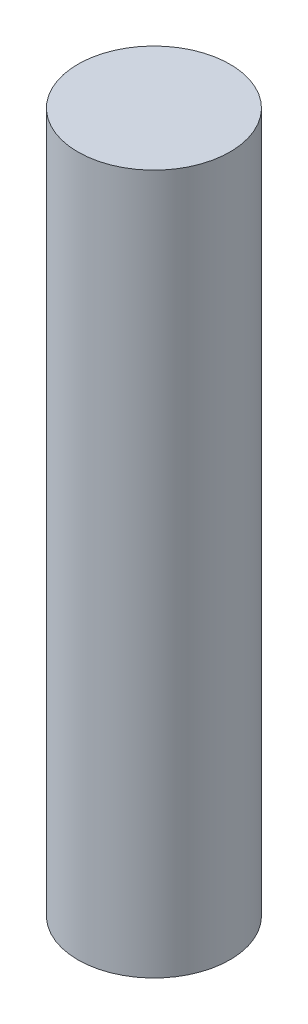
ISO-10303-21;
HEADER;
FILE_DESCRIPTION(('STEP AP214'),'2;1');
FILE_NAME('part.step','',(''),(''),'','','');
FILE_SCHEMA(('AUTOMOTIVE_DESIGN { 1 0 10303 214 1 1 1 1 }'));
ENDSEC;
DATA;
#1=APPLICATION_CONTEXT('core data for automotive mechanical design processes');
#2=APPLICATION_PROTOCOL_DEFINITION('international standard','automotive_design',2000,#1);
#3=PRODUCT_CONTEXT('',#1,'mechanical');
#4=PRODUCT('Part','Part','',(#3));
#5=PRODUCT_RELATED_PRODUCT_CATEGORY('part','',(#4));
#6=PRODUCT_DEFINITION_FORMATION('','',#4);
#7=PRODUCT_DEFINITION_CONTEXT('part definition',#1,'design');
#8=PRODUCT_DEFINITION('design','',#6,#7);
#9=PRODUCT_DEFINITION_SHAPE('','',#8);
#10=(LENGTH_UNIT() NAMED_UNIT(*) SI_UNIT(.MILLI.,.METRE.));
#11=(NAMED_UNIT(*) PLANE_ANGLE_UNIT() SI_UNIT($,.RADIAN.));
#12=(NAMED_UNIT(*) SI_UNIT($,.STERADIAN.) SOLID_ANGLE_UNIT());
#13=UNCERTAINTY_MEASURE_WITH_UNIT(LENGTH_MEASURE(1.E-05),#10,'distance_accuracy_value','');
#14=(GEOMETRIC_REPRESENTATION_CONTEXT(3) GLOBAL_UNCERTAINTY_ASSIGNED_CONTEXT((#13)) GLOBAL_UNIT_ASSIGNED_CONTEXT((#10,
#11,#12)) REPRESENTATION_CONTEXT('',''));
#15=CARTESIAN_POINT('',(0.,0.,0.));
#16=DIRECTION('',(0.,0.,1.));
#17=DIRECTION('',(1.,0.,0.));
#18=AXIS2_PLACEMENT_3D('',#15,#16,#17);
#19=CARTESIAN_POINT('',(0.,46.,0.));
#20=DIRECTION('',(0.,-1.,0.));
#21=DIRECTION('',(0.,0.,-1.));
#22=AXIS2_PLACEMENT_3D('',#19,#20,#21);
#23=CYLINDRICAL_SURFACE('',#22,5.);
#24=CARTESIAN_POINT('',(0.,46.,0.));
#25=DIRECTION('',(0.,1.,0.));
#26=DIRECTION('',(0.,0.,1.));
#27=AXIS2_PLACEMENT_3D('',#24,#25,#26);
#28=CIRCLE('',#27,5.);
#29=CARTESIAN_POINT('',(0.,46.,5.));
#30=VERTEX_POINT('',#29);
#31=EDGE_CURVE('E10',#30,#30,#28,.T.);
#32=ORIENTED_EDGE('',*,*,#31,.F.);
#33=EDGE_LOOP('',(#32));
#34=FACE_BOUND('',#33,.T.);
#35=CARTESIAN_POINT('',(0.,0.,0.));
#36=DIRECTION('',(0.,1.,0.));
#37=DIRECTION('',(0.,0.,1.));
#38=AXIS2_PLACEMENT_3D('',#35,#36,#37);
#39=CIRCLE('',#38,5.);
#40=CARTESIAN_POINT('',(0.,0.,5.));
#41=VERTEX_POINT('',#40);
#42=EDGE_CURVE('E36',#41,#41,#39,.T.);
#43=ORIENTED_EDGE('',*,*,#42,.T.);
#44=EDGE_LOOP('',(#43));
#45=FACE_BOUND('',#44,.T.);
#46=ADVANCED_FACE('F33',(#34,#45),#23,.T.);
#47=CARTESIAN_POINT('',(0.,46.,0.));
#48=DIRECTION('',(0.,1.,0.));
#49=DIRECTION('',(0.,0.,1.));
#50=AXIS2_PLACEMENT_3D('',#47,#48,#49);
#51=PLANE('',#50);
#52=ORIENTED_EDGE('',*,*,#31,.T.);
#53=EDGE_LOOP('',(#52));
#54=FACE_BOUND('',#53,.T.);
#55=ADVANCED_FACE('F48',(#54),#51,.T.);
#56=CARTESIAN_POINT('',(0.,0.,0.));
#57=DIRECTION('',(0.,1.,0.));
#58=DIRECTION('',(0.,0.,1.));
#59=AXIS2_PLACEMENT_3D('',#56,#57,#58);
#60=PLANE('',#59);
#61=ORIENTED_EDGE('',*,*,#42,.F.);
#62=EDGE_LOOP('',(#61));
#63=FACE_BOUND('',#62,.T.);
#64=ADVANCED_FACE('F46',(#63),#60,.F.);
#65=CLOSED_SHELL('',(#46,#55,#64));
#66=MANIFOLD_SOLID_BREP('B2',#65);
#67=ADVANCED_BREP_SHAPE_REPRESENTATION('',(#18,#66),#14);
#68=SHAPE_DEFINITION_REPRESENTATION(#9,#67);
ENDSEC;
END-ISO-10303-21;
